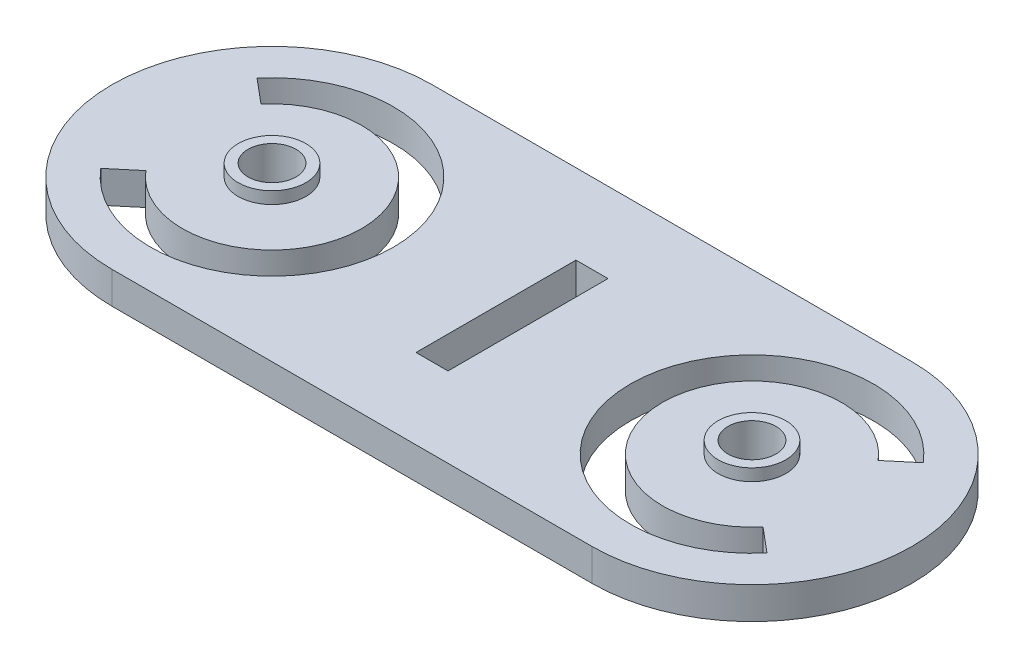
ISO-10303-21;
HEADER;
FILE_DESCRIPTION(('STEP AP214'),'2;1');
FILE_NAME('part.step','',(''),(''),'','','');
FILE_SCHEMA(('AUTOMOTIVE_DESIGN { 1 0 10303 214 1 1 1 1 }'));
ENDSEC;
DATA;
#1=APPLICATION_CONTEXT('core data for automotive mechanical design processes');
#2=APPLICATION_PROTOCOL_DEFINITION('international standard','automotive_design',2000,#1);
#3=PRODUCT_CONTEXT('',#1,'mechanical');
#4=PRODUCT('Part','Part','',(#3));
#5=PRODUCT_RELATED_PRODUCT_CATEGORY('part','',(#4));
#6=PRODUCT_DEFINITION_FORMATION('','',#4);
#7=PRODUCT_DEFINITION_CONTEXT('part definition',#1,'design');
#8=PRODUCT_DEFINITION('design','',#6,#7);
#9=PRODUCT_DEFINITION_SHAPE('','',#8);
#10=(LENGTH_UNIT() NAMED_UNIT(*) SI_UNIT(.MILLI.,.METRE.));
#11=(NAMED_UNIT(*) PLANE_ANGLE_UNIT() SI_UNIT($,.RADIAN.));
#12=(NAMED_UNIT(*) SI_UNIT($,.STERADIAN.) SOLID_ANGLE_UNIT());
#13=UNCERTAINTY_MEASURE_WITH_UNIT(LENGTH_MEASURE(1.E-05),#10,'distance_accuracy_value','');
#14=(GEOMETRIC_REPRESENTATION_CONTEXT(3) GLOBAL_UNCERTAINTY_ASSIGNED_CONTEXT((#13)) GLOBAL_UNIT_ASSIGNED_CONTEXT((#10,
#11,#12)) REPRESENTATION_CONTEXT('',''));
#15=CARTESIAN_POINT('',(0.,0.,0.));
#16=DIRECTION('',(0.,0.,1.));
#17=DIRECTION('',(1.,0.,0.));
#18=AXIS2_PLACEMENT_3D('',#15,#16,#17);
#19=CARTESIAN_POINT('',(-29.999999944,4.000000128,0.));
#20=DIRECTION('',(0.,1.,0.));
#21=DIRECTION('',(0.,0.,1.));
#22=AXIS2_PLACEMENT_3D('',#19,#20,#21);
#23=PLANE('',#22);
#24=CARTESIAN_POINT('',(29.999999944,4.000000128,0.));
#25=DIRECTION('',(0.,1.,0.));
#26=DIRECTION('',(0.,0.,-1.));
#27=AXIS2_PLACEMENT_3D('',#24,#25,#26);
#28=CIRCLE('',#27,4.2333418);
#29=CARTESIAN_POINT('',(29.999999944,4.000000128,-4.23334179999999));
#30=VERTEX_POINT('',#29);
#31=EDGE_CURVE('E570',#30,#30,#28,.T.);
#32=ORIENTED_EDGE('',*,*,#31,.F.);
#33=EDGE_LOOP('',(#32));
#34=FACE_BOUND('',#33,.T.);
#35=CARTESIAN_POINT('',(29.999999944,4.000000128,0.));
#36=DIRECTION('',(0.,1.,0.));
#37=DIRECTION('',(0.,0.,-1.));
#38=AXIS2_PLACEMENT_3D('',#35,#36,#37);
#39=CIRCLE('',#38,15.1949940348204);
#40=CARTESIAN_POINT('',(41.640032544,4.000000128,-9.76716360000001));
#41=VERTEX_POINT('',#40);
#42=CARTESIAN_POINT('',(41.640032544,4.000000128,9.76716359999999));
#43=VERTEX_POINT('',#42);
#44=EDGE_CURVE('E61',#41,#43,#39,.T.);
#45=ORIENTED_EDGE('',*,*,#44,.F.);
#46=DIRECTION('',(0.766040137871908,0.,-0.642792740445307));
#47=VECTOR('',#46,1.);
#48=CARTESIAN_POINT('',(41.640032544,4.000000128,-9.76716360000001));
#49=LINE('',#48,#47);
#50=CARTESIAN_POINT('',(38.575878144,4.000000128,-7.19599780000001));
#51=VERTEX_POINT('',#50);
#52=EDGE_CURVE('E270',#51,#41,#49,.T.);
#53=ORIENTED_EDGE('',*,*,#52,.F.);
#54=CARTESIAN_POINT('',(29.999999944,4.000000128,0.));
#55=DIRECTION('',(0.,-1.,0.));
#56=DIRECTION('',(0.,0.,-1.));
#57=AXIS2_PLACEMENT_3D('',#54,#55,#56);
#58=CIRCLE('',#57,11.1950020651557);
#59=CARTESIAN_POINT('',(38.575878144,4.000000128,7.19599779999999));
#60=VERTEX_POINT('',#59);
#61=EDGE_CURVE('E274',#60,#51,#58,.T.);
#62=ORIENTED_EDGE('',*,*,#61,.F.);
#63=DIRECTION('',(-0.76604013787191,0.,-0.642792740445305));
#64=VECTOR('',#63,1.);
#65=CARTESIAN_POINT('',(41.640032544,4.000000128,9.76716359999999));
#66=LINE('',#65,#64);
#67=EDGE_CURVE('E279',#43,#60,#66,.T.);
#68=ORIENTED_EDGE('',*,*,#67,.F.);
#69=EDGE_LOOP('',(#45,#53,#62,#68));
#70=FACE_BOUND('',#69,.T.);
#71=CARTESIAN_POINT('',(-29.999999944,4.000000128,0.));
#72=DIRECTION('',(0.,-1.,0.));
#73=DIRECTION('',(0.,0.,1.));
#74=AXIS2_PLACEMENT_3D('',#71,#72,#73);
#75=CIRCLE('',#74,11.1950020651557);
#76=CARTESIAN_POINT('',(-38.575878144,4.000000128,-7.19599779999999));
#77=VERTEX_POINT('',#76);
#78=CARTESIAN_POINT('',(-38.575878144,4.000000128,7.1959978));
#79=VERTEX_POINT('',#78);
#80=EDGE_CURVE('E69',#77,#79,#75,.T.);
#81=ORIENTED_EDGE('',*,*,#80,.F.);
#82=DIRECTION('',(0.766040137871909,0.,0.642792740445305));
#83=VECTOR('',#82,1.);
#84=CARTESIAN_POINT('',(-41.640032544,4.000000128,-9.76716359999999));
#85=LINE('',#84,#83);
#86=CARTESIAN_POINT('',(-41.640032544,4.000000128,-9.76716359999999));
#87=VERTEX_POINT('',#86);
#88=EDGE_CURVE('E223',#87,#77,#85,.T.);
#89=ORIENTED_EDGE('',*,*,#88,.F.);
#90=CARTESIAN_POINT('',(-29.999999944,4.000000128,0.));
#91=DIRECTION('',(0.,1.,0.));
#92=DIRECTION('',(0.,0.,1.));
#93=AXIS2_PLACEMENT_3D('',#90,#91,#92);
#94=CIRCLE('',#93,15.1949940348204);
#95=CARTESIAN_POINT('',(-41.640032544,4.000000128,9.7671636));
#96=VERTEX_POINT('',#95);
#97=EDGE_CURVE('E227',#96,#87,#94,.T.);
#98=ORIENTED_EDGE('',*,*,#97,.F.);
#99=DIRECTION('',(-0.766040137871909,0.,0.642792740445305));
#100=VECTOR('',#99,1.);
#101=CARTESIAN_POINT('',(-41.640032544,4.000000128,9.76716360000001));
#102=LINE('',#101,#100);
#103=EDGE_CURVE('E232',#79,#96,#102,.T.);
#104=ORIENTED_EDGE('',*,*,#103,.F.);
#105=EDGE_LOOP('',(#81,#89,#98,#104));
#106=FACE_BOUND('',#105,.T.);
#107=DIRECTION('',(0.,0.,-1.));
#108=VECTOR('',#107,1.);
#109=CARTESIAN_POINT('',(1.999996,4.000000128,-10.0000054));
#110=LINE('',#109,#108);
#111=CARTESIAN_POINT('',(1.999996,4.000000128,10.0000054));
#112=VERTEX_POINT('',#111);
#113=CARTESIAN_POINT('',(1.999996,4.000000128,-10.0000054));
#114=VERTEX_POINT('',#113);
#115=EDGE_CURVE('E162',#112,#114,#110,.T.);
#116=ORIENTED_EDGE('',*,*,#115,.F.);
#117=DIRECTION('',(1.,0.,0.));
#118=VECTOR('',#117,1.);
#119=CARTESIAN_POINT('',(-1.999996,4.000000128,10.0000054));
#120=LINE('',#119,#118);
#121=CARTESIAN_POINT('',(-1.999996,4.000000128,10.0000054));
#122=VERTEX_POINT('',#121);
#123=EDGE_CURVE('E173',#122,#112,#120,.T.);
#124=ORIENTED_EDGE('',*,*,#123,.F.);
#125=DIRECTION('',(0.,0.,1.));
#126=VECTOR('',#125,1.);
#127=CARTESIAN_POINT('',(-1.999996,4.000000128,-10.0000054));
#128=LINE('',#127,#126);
#129=CARTESIAN_POINT('',(-1.999996,4.000000128,-10.0000054));
#130=VERTEX_POINT('',#129);
#131=EDGE_CURVE('E179',#130,#122,#128,.T.);
#132=ORIENTED_EDGE('',*,*,#131,.F.);
#133=DIRECTION('',(-1.,0.,0.));
#134=VECTOR('',#133,1.);
#135=CARTESIAN_POINT('',(1.999996,4.000000128,-10.0000054));
#136=LINE('',#135,#134);
#137=EDGE_CURVE('E184',#114,#130,#136,.T.);
#138=ORIENTED_EDGE('',*,*,#137,.F.);
#139=EDGE_LOOP('',(#116,#124,#132,#138));
#140=FACE_BOUND('',#139,.T.);
#141=CARTESIAN_POINT('',(-29.999999944,4.000000128,0.));
#142=DIRECTION('',(0.,1.,0.));
#143=DIRECTION('',(0.,0.,1.));
#144=AXIS2_PLACEMENT_3D('',#141,#142,#143);
#145=CIRCLE('',#144,20.);
#146=CARTESIAN_POINT('',(-29.999999944,4.000000128,-20.));
#147=VERTEX_POINT('',#146);
#148=CARTESIAN_POINT('',(-29.999999944,4.000000128,20.));
#149=VERTEX_POINT('',#148);
#150=EDGE_CURVE('E299',#147,#149,#145,.T.);
#151=ORIENTED_EDGE('',*,*,#150,.T.);
#152=DIRECTION('',(1.,0.,0.));
#153=VECTOR('',#152,1.);
#154=CARTESIAN_POINT('',(-29.999999944,4.000000128,20.));
#155=LINE('',#154,#153);
#156=CARTESIAN_POINT('',(29.999999944,4.000000128,20.));
#157=VERTEX_POINT('',#156);
#158=EDGE_CURVE('E303',#149,#157,#155,.T.);
#159=ORIENTED_EDGE('',*,*,#158,.T.);
#160=CARTESIAN_POINT('',(29.999999944,4.000000128,0.));
#161=DIRECTION('',(0.,1.,0.));
#162=DIRECTION('',(0.,0.,1.));
#163=AXIS2_PLACEMENT_3D('',#160,#161,#162);
#164=CIRCLE('',#163,20.);
#165=CARTESIAN_POINT('',(29.999999944,4.000000128,-20.));
#166=VERTEX_POINT('',#165);
#167=EDGE_CURVE('E307',#157,#166,#164,.T.);
#168=ORIENTED_EDGE('',*,*,#167,.T.);
#169=DIRECTION('',(-1.,0.,0.));
#170=VECTOR('',#169,1.);
#171=CARTESIAN_POINT('',(-29.999999944,4.000000128,-20.));
#172=LINE('',#171,#170);
#173=EDGE_CURVE('E310',#166,#147,#172,.T.);
#174=ORIENTED_EDGE('',*,*,#173,.T.);
#175=EDGE_LOOP('',(#151,#159,#168,#174));
#176=FACE_BOUND('',#175,.T.);
#177=CARTESIAN_POINT('',(-29.999999944,4.000000128,0.));
#178=DIRECTION('',(0.,1.,0.));
#179=DIRECTION('',(0.,0.,1.));
#180=AXIS2_PLACEMENT_3D('',#177,#178,#179);
#181=CIRCLE('',#180,4.2333418);
#182=CARTESIAN_POINT('',(-29.999999944,4.000000128,4.23334180000001));
#183=VERTEX_POINT('',#182);
#184=EDGE_CURVE('E559',#183,#183,#181,.T.);
#185=ORIENTED_EDGE('',*,*,#184,.F.);
#186=EDGE_LOOP('',(#185));
#187=FACE_BOUND('',#186,.T.);
#188=ADVANCED_FACE('F45',(#34,#70,#106,#140,#176,#187),#23,.T.);
#189=CARTESIAN_POINT('',(-29.999999944,4.000000128,0.));
#190=DIRECTION('',(0.,-1.,0.));
#191=DIRECTION('',(0.,0.,-1.));
#192=AXIS2_PLACEMENT_3D('',#189,#190,#191);
#193=CYLINDRICAL_SURFACE('',#192,20.);
#194=CARTESIAN_POINT('',(-29.999999944,0.,0.));
#195=DIRECTION('',(0.,1.,0.));
#196=DIRECTION('',(0.,0.,1.));
#197=AXIS2_PLACEMENT_3D('',#194,#195,#196);
#198=CIRCLE('',#197,20.);
#199=CARTESIAN_POINT('',(-29.999999944,0.,-20.));
#200=VERTEX_POINT('',#199);
#201=CARTESIAN_POINT('',(-29.999999944,0.,20.));
#202=VERTEX_POINT('',#201);
#203=EDGE_CURVE('E191',#200,#202,#198,.T.);
#204=ORIENTED_EDGE('',*,*,#203,.T.);
#205=DIRECTION('',(0.,-1.,0.));
#206=VECTOR('',#205,1.);
#207=CARTESIAN_POINT('',(-29.999999944,4.000000128,20.));
#208=LINE('',#207,#206);
#209=EDGE_CURVE('E11',#149,#202,#208,.T.);
#210=ORIENTED_EDGE('',*,*,#209,.F.);
#211=ORIENTED_EDGE('',*,*,#150,.F.);
#212=DIRECTION('',(0.,-1.,0.));
#213=VECTOR('',#212,1.);
#214=CARTESIAN_POINT('',(-29.999999944,4.000000128,-20.));
#215=LINE('',#214,#213);
#216=EDGE_CURVE('E313',#147,#200,#215,.T.);
#217=ORIENTED_EDGE('',*,*,#216,.T.);
#218=EDGE_LOOP('',(#204,#210,#211,#217));
#219=FACE_BOUND('',#218,.T.);
#220=ADVANCED_FACE('F47',(#219),#193,.T.);
#221=CARTESIAN_POINT('',(-29.999999944,4.000000128,20.));
#222=DIRECTION('',(0.,0.,-1.));
#223=DIRECTION('',(-1.,0.,0.));
#224=AXIS2_PLACEMENT_3D('',#221,#222,#223);
#225=PLANE('',#224);
#226=DIRECTION('',(1.,0.,0.));
#227=VECTOR('',#226,1.);
#228=CARTESIAN_POINT('',(-29.999999944,0.,20.));
#229=LINE('',#228,#227);
#230=CARTESIAN_POINT('',(29.999999944,0.,20.));
#231=VERTEX_POINT('',#230);
#232=EDGE_CURVE('E317',#202,#231,#229,.T.);
#233=ORIENTED_EDGE('',*,*,#232,.T.);
#234=DIRECTION('',(0.,-1.,0.));
#235=VECTOR('',#234,1.);
#236=CARTESIAN_POINT('',(29.999999944,4.000000128,20.));
#237=LINE('',#236,#235);
#238=EDGE_CURVE('E54',#157,#231,#237,.T.);
#239=ORIENTED_EDGE('',*,*,#238,.F.);
#240=ORIENTED_EDGE('',*,*,#158,.F.);
#241=ORIENTED_EDGE('',*,*,#209,.T.);
#242=EDGE_LOOP('',(#233,#239,#240,#241));
#243=FACE_BOUND('',#242,.T.);
#244=ADVANCED_FACE('F352',(#243),#225,.F.);
#245=CARTESIAN_POINT('',(29.999999944,4.000000128,0.));
#246=DIRECTION('',(0.,-1.,0.));
#247=DIRECTION('',(0.,0.,-1.));
#248=AXIS2_PLACEMENT_3D('',#245,#246,#247);
#249=CYLINDRICAL_SURFACE('',#248,20.);
#250=CARTESIAN_POINT('',(29.999999944,0.,0.));
#251=DIRECTION('',(0.,1.,0.));
#252=DIRECTION('',(0.,0.,1.));
#253=AXIS2_PLACEMENT_3D('',#250,#251,#252);
#254=CIRCLE('',#253,20.);
#255=CARTESIAN_POINT('',(29.999999944,0.,-20.));
#256=VERTEX_POINT('',#255);
#257=EDGE_CURVE('E320',#231,#256,#254,.T.);
#258=ORIENTED_EDGE('',*,*,#257,.T.);
#259=DIRECTION('',(0.,-1.,0.));
#260=VECTOR('',#259,1.);
#261=CARTESIAN_POINT('',(29.999999944,4.000000128,-20.));
#262=LINE('',#261,#260);
#263=EDGE_CURVE('E328',#166,#256,#262,.T.);
#264=ORIENTED_EDGE('',*,*,#263,.F.);
#265=ORIENTED_EDGE('',*,*,#167,.F.);
#266=ORIENTED_EDGE('',*,*,#238,.T.);
#267=EDGE_LOOP('',(#258,#264,#265,#266));
#268=FACE_BOUND('',#267,.T.);
#269=ADVANCED_FACE('F337',(#268),#249,.T.);
#270=CARTESIAN_POINT('',(-29.999999944,4.000000128,-20.));
#271=DIRECTION('',(0.,0.,1.));
#272=DIRECTION('',(1.,0.,0.));
#273=AXIS2_PLACEMENT_3D('',#270,#271,#272);
#274=PLANE('',#273);
#275=DIRECTION('',(-1.,0.,0.));
#276=VECTOR('',#275,1.);
#277=CARTESIAN_POINT('',(-29.999999944,0.,-20.));
#278=LINE('',#277,#276);
#279=EDGE_CURVE('E304',#256,#200,#278,.T.);
#280=ORIENTED_EDGE('',*,*,#279,.T.);
#281=ORIENTED_EDGE('',*,*,#216,.F.);
#282=ORIENTED_EDGE('',*,*,#173,.F.);
#283=ORIENTED_EDGE('',*,*,#263,.T.);
#284=EDGE_LOOP('',(#280,#281,#282,#283));
#285=FACE_BOUND('',#284,.T.);
#286=ADVANCED_FACE('F346',(#285),#274,.F.);
#287=CARTESIAN_POINT('',(-29.999999944,0.,0.));
#288=DIRECTION('',(0.,1.,0.));
#289=DIRECTION('',(0.,0.,1.));
#290=AXIS2_PLACEMENT_3D('',#287,#288,#289);
#291=PLANE('',#290);
#292=DIRECTION('',(0.766040137871908,0.,-0.642792740445307));
#293=VECTOR('',#292,1.);
#294=CARTESIAN_POINT('',(41.640032544,0.,-9.76716360000001));
#295=LINE('',#294,#293);
#296=CARTESIAN_POINT('',(38.575878144,0.,-7.19599780000001));
#297=VERTEX_POINT('',#296);
#298=CARTESIAN_POINT('',(41.640032544,0.,-9.76716360000001));
#299=VERTEX_POINT('',#298);
#300=EDGE_CURVE('E261',#297,#299,#295,.T.);
#301=ORIENTED_EDGE('',*,*,#300,.T.);
#302=CARTESIAN_POINT('',(29.999999944,0.,0.));
#303=DIRECTION('',(0.,1.,0.));
#304=DIRECTION('',(0.,0.,-1.));
#305=AXIS2_PLACEMENT_3D('',#302,#303,#304);
#306=CIRCLE('',#305,15.1949940348204);
#307=CARTESIAN_POINT('',(41.640032544,0.,9.76716359999999));
#308=VERTEX_POINT('',#307);
#309=EDGE_CURVE('E275',#299,#308,#306,.T.);
#310=ORIENTED_EDGE('',*,*,#309,.T.);
#311=DIRECTION('',(-0.76604013787191,0.,-0.642792740445305));
#312=VECTOR('',#311,1.);
#313=CARTESIAN_POINT('',(41.640032544,0.,9.76716359999999));
#314=LINE('',#313,#312);
#315=CARTESIAN_POINT('',(38.575878144,0.,7.19599779999997));
#316=VERTEX_POINT('',#315);
#317=EDGE_CURVE('E292',#308,#316,#314,.T.);
#318=ORIENTED_EDGE('',*,*,#317,.T.);
#319=CARTESIAN_POINT('',(29.999999944,0.,0.));
#320=DIRECTION('',(0.,-1.,0.));
#321=DIRECTION('',(0.,0.,-1.));
#322=AXIS2_PLACEMENT_3D('',#319,#320,#321);
#323=CIRCLE('',#322,11.1950020651557);
#324=EDGE_CURVE('E288',#316,#297,#323,.T.);
#325=ORIENTED_EDGE('',*,*,#324,.T.);
#326=EDGE_LOOP('',(#301,#310,#318,#325));
#327=FACE_BOUND('',#326,.T.);
#328=CARTESIAN_POINT('',(29.999999944,0.,0.));
#329=DIRECTION('',(0.,1.,0.));
#330=DIRECTION('',(0.,0.,-1.));
#331=AXIS2_PLACEMENT_3D('',#328,#329,#330);
#332=CIRCLE('',#331,2.999994);
#333=CARTESIAN_POINT('',(29.999999944,0.,-2.999994));
#334=VERTEX_POINT('',#333);
#335=EDGE_CURVE('E252',#334,#334,#332,.T.);
#336=ORIENTED_EDGE('',*,*,#335,.T.);
#337=EDGE_LOOP('',(#336));
#338=FACE_BOUND('',#337,.T.);
#339=DIRECTION('',(0.766040137871909,0.,0.642792740445305));
#340=VECTOR('',#339,1.);
#341=CARTESIAN_POINT('',(-41.640032544,0.,-9.76716359999999));
#342=LINE('',#341,#340);
#343=CARTESIAN_POINT('',(-41.640032544,0.,-9.76716359999999));
#344=VERTEX_POINT('',#343);
#345=CARTESIAN_POINT('',(-38.575878144,0.,-7.19599779999999));
#346=VERTEX_POINT('',#345);
#347=EDGE_CURVE('E213',#344,#346,#342,.T.);
#348=ORIENTED_EDGE('',*,*,#347,.T.);
#349=CARTESIAN_POINT('',(-29.999999944,0.,0.));
#350=DIRECTION('',(0.,-1.,0.));
#351=DIRECTION('',(0.,0.,1.));
#352=AXIS2_PLACEMENT_3D('',#349,#350,#351);
#353=CIRCLE('',#352,11.1950020651557);
#354=CARTESIAN_POINT('',(-38.575878144,0.,7.19599780000001));
#355=VERTEX_POINT('',#354);
#356=EDGE_CURVE('E228',#346,#355,#353,.T.);
#357=ORIENTED_EDGE('',*,*,#356,.T.);
#358=DIRECTION('',(-0.766040137871909,0.,0.642792740445305));
#359=VECTOR('',#358,1.);
#360=CARTESIAN_POINT('',(-41.640032544,0.,9.76716360000001));
#361=LINE('',#360,#359);
#362=CARTESIAN_POINT('',(-41.640032544,0.,9.76716360000001));
#363=VERTEX_POINT('',#362);
#364=EDGE_CURVE('E245',#355,#363,#361,.T.);
#365=ORIENTED_EDGE('',*,*,#364,.T.);
#366=CARTESIAN_POINT('',(-29.999999944,0.,0.));
#367=DIRECTION('',(0.,1.,0.));
#368=DIRECTION('',(0.,0.,1.));
#369=AXIS2_PLACEMENT_3D('',#366,#367,#368);
#370=CIRCLE('',#369,15.1949940348204);
#371=EDGE_CURVE('E241',#363,#344,#370,.T.);
#372=ORIENTED_EDGE('',*,*,#371,.T.);
#373=EDGE_LOOP('',(#348,#357,#365,#372));
#374=FACE_BOUND('',#373,.T.);
#375=DIRECTION('',(1.,0.,0.));
#376=VECTOR('',#375,1.);
#377=CARTESIAN_POINT('',(-1.999996,0.,10.0000054));
#378=LINE('',#377,#376);
#379=CARTESIAN_POINT('',(-1.999996,0.,10.0000054));
#380=VERTEX_POINT('',#379);
#381=CARTESIAN_POINT('',(1.999996,0.,10.0000054));
#382=VERTEX_POINT('',#381);
#383=EDGE_CURVE('E196',#380,#382,#378,.T.);
#384=ORIENTED_EDGE('',*,*,#383,.T.);
#385=DIRECTION('',(0.,0.,-1.));
#386=VECTOR('',#385,1.);
#387=CARTESIAN_POINT('',(1.999996,0.,-10.0000054));
#388=LINE('',#387,#386);
#389=CARTESIAN_POINT('',(1.999996,0.,-10.0000054));
#390=VERTEX_POINT('',#389);
#391=EDGE_CURVE('E165',#382,#390,#388,.T.);
#392=ORIENTED_EDGE('',*,*,#391,.T.);
#393=DIRECTION('',(-1.,0.,0.));
#394=VECTOR('',#393,1.);
#395=CARTESIAN_POINT('',(1.999996,0.,-10.0000054));
#396=LINE('',#395,#394);
#397=CARTESIAN_POINT('',(-1.999996,0.,-10.0000054));
#398=VERTEX_POINT('',#397);
#399=EDGE_CURVE('E204',#390,#398,#396,.T.);
#400=ORIENTED_EDGE('',*,*,#399,.T.);
#401=DIRECTION('',(0.,0.,1.));
#402=VECTOR('',#401,1.);
#403=CARTESIAN_POINT('',(-1.999996,0.,-10.0000054));
#404=LINE('',#403,#402);
#405=EDGE_CURVE('E199',#398,#380,#404,.T.);
#406=ORIENTED_EDGE('',*,*,#405,.T.);
#407=EDGE_LOOP('',(#384,#392,#400,#406));
#408=FACE_BOUND('',#407,.T.);
#409=CARTESIAN_POINT('',(-29.999999944,0.,0.));
#410=DIRECTION('',(0.,1.,0.));
#411=DIRECTION('',(0.,0.,1.));
#412=AXIS2_PLACEMENT_3D('',#409,#410,#411);
#413=CIRCLE('',#412,2.999994);
#414=CARTESIAN_POINT('',(-29.999999944,0.,2.999994));
#415=VERTEX_POINT('',#414);
#416=EDGE_CURVE('E186',#415,#415,#413,.T.);
#417=ORIENTED_EDGE('',*,*,#416,.T.);
#418=EDGE_LOOP('',(#417));
#419=FACE_BOUND('',#418,.T.);
#420=ORIENTED_EDGE('',*,*,#203,.F.);
#421=ORIENTED_EDGE('',*,*,#279,.F.);
#422=ORIENTED_EDGE('',*,*,#257,.F.);
#423=ORIENTED_EDGE('',*,*,#232,.F.);
#424=EDGE_LOOP('',(#420,#421,#422,#423));
#425=FACE_BOUND('',#424,.T.);
#426=ADVANCED_FACE('F343',(#327,#338,#374,#408,#419,#425),#291,.F.);
#427=CARTESIAN_POINT('',(-29.999999944,0.,0.));
#428=DIRECTION('',(0.,1.,0.));
#429=DIRECTION('',(0.,0.,1.));
#430=AXIS2_PLACEMENT_3D('',#427,#428,#429);
#431=CYLINDRICAL_SURFACE('',#430,2.999994);
#432=ORIENTED_EDGE('',*,*,#416,.F.);
#433=EDGE_LOOP('',(#432));
#434=FACE_BOUND('',#433,.T.);
#435=CARTESIAN_POINT('',(-29.999999944,5.499997128,0.));
#436=DIRECTION('',(0.,1.,0.));
#437=DIRECTION('',(0.,0.,1.));
#438=AXIS2_PLACEMENT_3D('',#435,#436,#437);
#439=CIRCLE('',#438,2.999994);
#440=CARTESIAN_POINT('',(-29.999999944,5.499997128,2.999994));
#441=VERTEX_POINT('',#440);
#442=EDGE_CURVE('E561',#441,#441,#439,.T.);
#443=ORIENTED_EDGE('',*,*,#442,.T.);
#444=EDGE_LOOP('',(#443));
#445=FACE_BOUND('',#444,.T.);
#446=ADVANCED_FACE('F370',(#434,#445),#431,.F.);
#447=CARTESIAN_POINT('',(1.999996,0.,-10.0000054));
#448=DIRECTION('',(1.,0.,0.));
#449=DIRECTION('',(0.,0.,-1.));
#450=AXIS2_PLACEMENT_3D('',#447,#448,#449);
#451=PLANE('',#450);
#452=ORIENTED_EDGE('',*,*,#115,.T.);
#453=DIRECTION('',(0.,1.,0.));
#454=VECTOR('',#453,1.);
#455=CARTESIAN_POINT('',(1.999996,0.,-10.0000054));
#456=LINE('',#455,#454);
#457=EDGE_CURVE('E200',#390,#114,#456,.T.);
#458=ORIENTED_EDGE('',*,*,#457,.F.);
#459=ORIENTED_EDGE('',*,*,#391,.F.);
#460=DIRECTION('',(0.,1.,0.));
#461=VECTOR('',#460,1.);
#462=CARTESIAN_POINT('',(1.999996,0.,10.0000054));
#463=LINE('',#462,#461);
#464=EDGE_CURVE('E158',#382,#112,#463,.T.);
#465=ORIENTED_EDGE('',*,*,#464,.T.);
#466=EDGE_LOOP('',(#452,#458,#459,#465));
#467=FACE_BOUND('',#466,.T.);
#468=ADVANCED_FACE('F160',(#467),#451,.F.);
#469=CARTESIAN_POINT('',(-1.999996,0.,10.0000054));
#470=DIRECTION('',(0.,0.,1.));
#471=DIRECTION('',(1.,0.,0.));
#472=AXIS2_PLACEMENT_3D('',#469,#470,#471);
#473=PLANE('',#472);
#474=ORIENTED_EDGE('',*,*,#123,.T.);
#475=ORIENTED_EDGE('',*,*,#464,.F.);
#476=ORIENTED_EDGE('',*,*,#383,.F.);
#477=DIRECTION('',(0.,1.,0.));
#478=VECTOR('',#477,1.);
#479=CARTESIAN_POINT('',(-1.999996,0.,10.0000054));
#480=LINE('',#479,#478);
#481=EDGE_CURVE('E170',#380,#122,#480,.T.);
#482=ORIENTED_EDGE('',*,*,#481,.T.);
#483=EDGE_LOOP('',(#474,#475,#476,#482));
#484=FACE_BOUND('',#483,.T.);
#485=ADVANCED_FACE('F174',(#484),#473,.F.);
#486=CARTESIAN_POINT('',(-1.999996,0.,-10.0000054));
#487=DIRECTION('',(-1.,0.,0.));
#488=DIRECTION('',(0.,0.,1.));
#489=AXIS2_PLACEMENT_3D('',#486,#487,#488);
#490=PLANE('',#489);
#491=ORIENTED_EDGE('',*,*,#131,.T.);
#492=ORIENTED_EDGE('',*,*,#481,.F.);
#493=ORIENTED_EDGE('',*,*,#405,.F.);
#494=DIRECTION('',(0.,1.,0.));
#495=VECTOR('',#494,1.);
#496=CARTESIAN_POINT('',(-1.999996,0.,-10.0000054));
#497=LINE('',#496,#495);
#498=EDGE_CURVE('E583',#398,#130,#497,.T.);
#499=ORIENTED_EDGE('',*,*,#498,.T.);
#500=EDGE_LOOP('',(#491,#492,#493,#499));
#501=FACE_BOUND('',#500,.T.);
#502=ADVANCED_FACE('F400',(#501),#490,.F.);
#503=CARTESIAN_POINT('',(1.999996,0.,-10.0000054));
#504=DIRECTION('',(0.,0.,-1.));
#505=DIRECTION('',(-1.,0.,0.));
#506=AXIS2_PLACEMENT_3D('',#503,#504,#505);
#507=PLANE('',#506);
#508=ORIENTED_EDGE('',*,*,#137,.T.);
#509=ORIENTED_EDGE('',*,*,#498,.F.);
#510=ORIENTED_EDGE('',*,*,#399,.F.);
#511=ORIENTED_EDGE('',*,*,#457,.T.);
#512=EDGE_LOOP('',(#508,#509,#510,#511));
#513=FACE_BOUND('',#512,.T.);
#514=ADVANCED_FACE('F408',(#513),#507,.F.);
#515=CARTESIAN_POINT('',(-29.999999944,0.,0.));
#516=DIRECTION('',(0.,1.,0.));
#517=DIRECTION('',(0.,0.,1.));
#518=AXIS2_PLACEMENT_3D('',#515,#516,#517);
#519=CYLINDRICAL_SURFACE('',#518,11.1950020651557);
#520=ORIENTED_EDGE('',*,*,#80,.T.);
#521=DIRECTION('',(0.,1.,0.));
#522=VECTOR('',#521,1.);
#523=CARTESIAN_POINT('',(-38.575878144,0.,7.19599780000001));
#524=LINE('',#523,#522);
#525=EDGE_CURVE('E210',#355,#79,#524,.T.);
#526=ORIENTED_EDGE('',*,*,#525,.F.);
#527=ORIENTED_EDGE('',*,*,#356,.F.);
#528=DIRECTION('',(0.,1.,0.));
#529=VECTOR('',#528,1.);
#530=CARTESIAN_POINT('',(-38.575878144,0.,-7.19599779999999));
#531=LINE('',#530,#529);
#532=EDGE_CURVE('E220',#346,#77,#531,.T.);
#533=ORIENTED_EDGE('',*,*,#532,.T.);
#534=EDGE_LOOP('',(#520,#526,#527,#533));
#535=FACE_BOUND('',#534,.T.);
#536=ADVANCED_FACE('F417',(#535),#519,.T.);
#537=CARTESIAN_POINT('',(-41.640032544,0.,-9.76716359999999));
#538=DIRECTION('',(-0.642792740445305,0.,0.766040137871909));
#539=DIRECTION('',(0.76604013787191,0.,0.642792740445305));
#540=AXIS2_PLACEMENT_3D('',#537,#538,#539);
#541=PLANE('',#540);
#542=ORIENTED_EDGE('',*,*,#88,.T.);
#543=ORIENTED_EDGE('',*,*,#532,.F.);
#544=ORIENTED_EDGE('',*,*,#347,.F.);
#545=DIRECTION('',(0.,1.,0.));
#546=VECTOR('',#545,1.);
#547=CARTESIAN_POINT('',(-41.640032544,0.,-9.76716359999999));
#548=LINE('',#547,#546);
#549=EDGE_CURVE('E217',#344,#87,#548,.T.);
#550=ORIENTED_EDGE('',*,*,#549,.T.);
#551=EDGE_LOOP('',(#542,#543,#544,#550));
#552=FACE_BOUND('',#551,.T.);
#553=ADVANCED_FACE('F426',(#552),#541,.F.);
#554=CARTESIAN_POINT('',(-29.999999944,0.,0.));
#555=DIRECTION('',(0.,1.,0.));
#556=DIRECTION('',(0.,0.,1.));
#557=AXIS2_PLACEMENT_3D('',#554,#555,#556);
#558=CYLINDRICAL_SURFACE('',#557,15.1949940348204);
#559=ORIENTED_EDGE('',*,*,#97,.T.);
#560=ORIENTED_EDGE('',*,*,#549,.F.);
#561=ORIENTED_EDGE('',*,*,#371,.F.);
#562=DIRECTION('',(0.,1.,0.));
#563=VECTOR('',#562,1.);
#564=CARTESIAN_POINT('',(-41.640032544,0.,9.7671636));
#565=LINE('',#564,#563);
#566=EDGE_CURVE('E214',#363,#96,#565,.T.);
#567=ORIENTED_EDGE('',*,*,#566,.T.);
#568=EDGE_LOOP('',(#559,#560,#561,#567));
#569=FACE_BOUND('',#568,.T.);
#570=ADVANCED_FACE('F434',(#569),#558,.F.);
#571=CARTESIAN_POINT('',(-41.640032544,0.,9.76716360000001));
#572=DIRECTION('',(-0.642792740445305,0.,-0.766040137871909));
#573=DIRECTION('',(-0.76604013787191,0.,0.642792740445305));
#574=AXIS2_PLACEMENT_3D('',#571,#572,#573);
#575=PLANE('',#574);
#576=ORIENTED_EDGE('',*,*,#103,.T.);
#577=ORIENTED_EDGE('',*,*,#566,.F.);
#578=ORIENTED_EDGE('',*,*,#364,.F.);
#579=ORIENTED_EDGE('',*,*,#525,.T.);
#580=EDGE_LOOP('',(#576,#577,#578,#579));
#581=FACE_BOUND('',#580,.T.);
#582=ADVANCED_FACE('F443',(#581),#575,.F.);
#583=CARTESIAN_POINT('',(29.999999944,0.,0.));
#584=DIRECTION('',(0.,1.,0.));
#585=DIRECTION('',(0.,0.,1.));
#586=AXIS2_PLACEMENT_3D('',#583,#584,#585);
#587=CYLINDRICAL_SURFACE('',#586,2.999994);
#588=ORIENTED_EDGE('',*,*,#335,.F.);
#589=EDGE_LOOP('',(#588));
#590=FACE_BOUND('',#589,.T.);
#591=CARTESIAN_POINT('',(29.999999944,5.499997128,0.));
#592=DIRECTION('',(0.,1.,0.));
#593=DIRECTION('',(0.,0.,-1.));
#594=AXIS2_PLACEMENT_3D('',#591,#592,#593);
#595=CIRCLE('',#594,2.999994);
#596=CARTESIAN_POINT('',(29.999999944,5.499997128,-2.99999399999999));
#597=VERTEX_POINT('',#596);
#598=EDGE_CURVE('E567',#597,#597,#595,.T.);
#599=ORIENTED_EDGE('',*,*,#598,.T.);
#600=EDGE_LOOP('',(#599));
#601=FACE_BOUND('',#600,.T.);
#602=ADVANCED_FACE('F452',(#590,#601),#587,.F.);
#603=CARTESIAN_POINT('',(29.999999944,0.,0.));
#604=DIRECTION('',(0.,1.,0.));
#605=DIRECTION('',(0.,0.,1.));
#606=AXIS2_PLACEMENT_3D('',#603,#604,#605);
#607=CYLINDRICAL_SURFACE('',#606,15.1949940348204);
#608=ORIENTED_EDGE('',*,*,#44,.T.);
#609=DIRECTION('',(0.,1.,0.));
#610=VECTOR('',#609,1.);
#611=CARTESIAN_POINT('',(41.640032544,0.,9.76716359999999));
#612=LINE('',#611,#610);
#613=EDGE_CURVE('E258',#308,#43,#612,.T.);
#614=ORIENTED_EDGE('',*,*,#613,.F.);
#615=ORIENTED_EDGE('',*,*,#309,.F.);
#616=DIRECTION('',(0.,1.,0.));
#617=VECTOR('',#616,1.);
#618=CARTESIAN_POINT('',(41.640032544,0.,-9.76716360000001));
#619=LINE('',#618,#617);
#620=EDGE_CURVE('E256',#299,#41,#619,.T.);
#621=ORIENTED_EDGE('',*,*,#620,.T.);
#622=EDGE_LOOP('',(#608,#614,#615,#621));
#623=FACE_BOUND('',#622,.T.);
#624=ADVANCED_FACE('F459',(#623),#607,.F.);
#625=CARTESIAN_POINT('',(41.640032544,0.,-9.76716360000001));
#626=DIRECTION('',(0.642792740445307,0.,0.766040137871908));
#627=DIRECTION('',(0.766040137871908,0.,-0.642792740445307));
#628=AXIS2_PLACEMENT_3D('',#625,#626,#627);
#629=PLANE('',#628);
#630=ORIENTED_EDGE('',*,*,#52,.T.);
#631=ORIENTED_EDGE('',*,*,#620,.F.);
#632=ORIENTED_EDGE('',*,*,#300,.F.);
#633=DIRECTION('',(0.,1.,0.));
#634=VECTOR('',#633,1.);
#635=CARTESIAN_POINT('',(38.575878144,0.,-7.19599780000001));
#636=LINE('',#635,#634);
#637=EDGE_CURVE('E265',#297,#51,#636,.T.);
#638=ORIENTED_EDGE('',*,*,#637,.T.);
#639=EDGE_LOOP('',(#630,#631,#632,#638));
#640=FACE_BOUND('',#639,.T.);
#641=ADVANCED_FACE('F463',(#640),#629,.F.);
#642=CARTESIAN_POINT('',(29.999999944,0.,0.));
#643=DIRECTION('',(0.,1.,0.));
#644=DIRECTION('',(0.,0.,1.));
#645=AXIS2_PLACEMENT_3D('',#642,#643,#644);
#646=CYLINDRICAL_SURFACE('',#645,11.1950020651557);
#647=ORIENTED_EDGE('',*,*,#61,.T.);
#648=ORIENTED_EDGE('',*,*,#637,.F.);
#649=ORIENTED_EDGE('',*,*,#324,.F.);
#650=DIRECTION('',(0.,1.,0.));
#651=VECTOR('',#650,1.);
#652=CARTESIAN_POINT('',(38.575878144,0.,7.19599779999999));
#653=LINE('',#652,#651);
#654=EDGE_CURVE('E262',#316,#60,#653,.T.);
#655=ORIENTED_EDGE('',*,*,#654,.T.);
#656=EDGE_LOOP('',(#647,#648,#649,#655));
#657=FACE_BOUND('',#656,.T.);
#658=ADVANCED_FACE('F471',(#657),#646,.T.);
#659=CARTESIAN_POINT('',(41.640032544,0.,9.76716359999999));
#660=DIRECTION('',(0.642792740445305,0.,-0.76604013787191));
#661=DIRECTION('',(-0.76604013787191,0.,-0.642792740445305));
#662=AXIS2_PLACEMENT_3D('',#659,#660,#661);
#663=PLANE('',#662);
#664=ORIENTED_EDGE('',*,*,#67,.T.);
#665=ORIENTED_EDGE('',*,*,#654,.F.);
#666=ORIENTED_EDGE('',*,*,#317,.F.);
#667=ORIENTED_EDGE('',*,*,#613,.T.);
#668=EDGE_LOOP('',(#664,#665,#666,#667));
#669=FACE_BOUND('',#668,.T.);
#670=ADVANCED_FACE('F478',(#669),#663,.F.);
#671=CARTESIAN_POINT('',(29.999999944,5.499997128,0.));
#672=DIRECTION('',(0.,-1.,0.));
#673=DIRECTION('',(0.,0.,-1.));
#674=AXIS2_PLACEMENT_3D('',#671,#672,#673);
#675=PLANE('',#674);
#676=CARTESIAN_POINT('',(29.999999944,5.499997128,0.));
#677=DIRECTION('',(0.,1.,0.));
#678=DIRECTION('',(0.,0.,-1.));
#679=AXIS2_PLACEMENT_3D('',#676,#677,#678);
#680=CIRCLE('',#679,4.2333418);
#681=CARTESIAN_POINT('',(29.999999944,5.499997128,-4.23334179999999));
#682=VERTEX_POINT('',#681);
#683=EDGE_CURVE('E574',#682,#682,#680,.T.);
#684=ORIENTED_EDGE('',*,*,#683,.T.);
#685=EDGE_LOOP('',(#684));
#686=FACE_BOUND('',#685,.T.);
#687=ORIENTED_EDGE('',*,*,#598,.F.);
#688=EDGE_LOOP('',(#687));
#689=FACE_BOUND('',#688,.T.);
#690=ADVANCED_FACE('F486',(#686,#689),#675,.F.);
#691=CARTESIAN_POINT('',(29.999999944,5.499997128,0.));
#692=DIRECTION('',(0.,-1.,0.));
#693=DIRECTION('',(0.,0.,-1.));
#694=AXIS2_PLACEMENT_3D('',#691,#692,#693);
#695=CYLINDRICAL_SURFACE('',#694,4.2333418);
#696=ORIENTED_EDGE('',*,*,#683,.F.);
#697=EDGE_LOOP('',(#696));
#698=FACE_BOUND('',#697,.T.);
#699=ORIENTED_EDGE('',*,*,#31,.T.);
#700=EDGE_LOOP('',(#699));
#701=FACE_BOUND('',#700,.T.);
#702=ADVANCED_FACE('F521',(#698,#701),#695,.T.);
#703=CARTESIAN_POINT('',(-29.999999944,5.499997128,0.));
#704=DIRECTION('',(0.,1.,0.));
#705=DIRECTION('',(0.,0.,1.));
#706=AXIS2_PLACEMENT_3D('',#703,#704,#705);
#707=PLANE('',#706);
#708=CARTESIAN_POINT('',(-29.999999944,5.499997128,0.));
#709=DIRECTION('',(0.,1.,0.));
#710=DIRECTION('',(0.,0.,1.));
#711=AXIS2_PLACEMENT_3D('',#708,#709,#710);
#712=CIRCLE('',#711,4.2333418);
#713=CARTESIAN_POINT('',(-29.999999944,5.499997128,4.23334180000001));
#714=VERTEX_POINT('',#713);
#715=EDGE_CURVE('E257',#714,#714,#712,.T.);
#716=ORIENTED_EDGE('',*,*,#715,.T.);
#717=EDGE_LOOP('',(#716));
#718=FACE_BOUND('',#717,.T.);
#719=ORIENTED_EDGE('',*,*,#442,.F.);
#720=EDGE_LOOP('',(#719));
#721=FACE_BOUND('',#720,.T.);
#722=ADVANCED_FACE('F531',(#718,#721),#707,.T.);
#723=CARTESIAN_POINT('',(-29.999999944,5.499997128,0.));
#724=DIRECTION('',(0.,-1.,0.));
#725=DIRECTION('',(0.,0.,-1.));
#726=AXIS2_PLACEMENT_3D('',#723,#724,#725);
#727=CYLINDRICAL_SURFACE('',#726,4.2333418);
#728=ORIENTED_EDGE('',*,*,#715,.F.);
#729=EDGE_LOOP('',(#728));
#730=FACE_BOUND('',#729,.T.);
#731=ORIENTED_EDGE('',*,*,#184,.T.);
#732=EDGE_LOOP('',(#731));
#733=FACE_BOUND('',#732,.T.);
#734=ADVANCED_FACE('F541',(#730,#733),#727,.T.);
#735=CLOSED_SHELL('',(#188,#220,#244,#269,#286,#426,#446,#468,#485,#502,#514,#536,#553,#570,
#582,#602,#624,#641,#658,#670,#690,#702,#722,#734));
#736=MANIFOLD_SOLID_BREP('B2',#735);
#737=ADVANCED_BREP_SHAPE_REPRESENTATION('',(#18,#736),#14);
#738=SHAPE_DEFINITION_REPRESENTATION(#9,#737);
ENDSEC;
END-ISO-10303-21;
